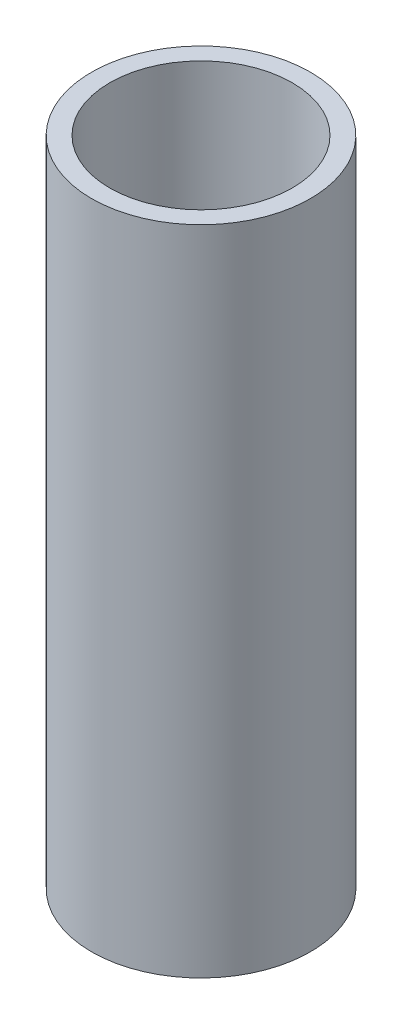
ISO-10303-21;
HEADER;
FILE_DESCRIPTION(('STEP AP214'),'2;1');
FILE_NAME('part.step','',(''),(''),'','','');
FILE_SCHEMA(('AUTOMOTIVE_DESIGN { 1 0 10303 214 1 1 1 1 }'));
ENDSEC;
DATA;
#1=APPLICATION_CONTEXT('core data for automotive mechanical design processes');
#2=APPLICATION_PROTOCOL_DEFINITION('international standard','automotive_design',2000,#1);
#3=PRODUCT_CONTEXT('',#1,'mechanical');
#4=PRODUCT('Part','Part','',(#3));
#5=PRODUCT_RELATED_PRODUCT_CATEGORY('part','',(#4));
#6=PRODUCT_DEFINITION_FORMATION('','',#4);
#7=PRODUCT_DEFINITION_CONTEXT('part definition',#1,'design');
#8=PRODUCT_DEFINITION('design','',#6,#7);
#9=PRODUCT_DEFINITION_SHAPE('','',#8);
#10=(LENGTH_UNIT() NAMED_UNIT(*) SI_UNIT(.MILLI.,.METRE.));
#11=(NAMED_UNIT(*) PLANE_ANGLE_UNIT() SI_UNIT($,.RADIAN.));
#12=(NAMED_UNIT(*) SI_UNIT($,.STERADIAN.) SOLID_ANGLE_UNIT());
#13=UNCERTAINTY_MEASURE_WITH_UNIT(LENGTH_MEASURE(1.E-05),#10,'distance_accuracy_value','');
#14=(GEOMETRIC_REPRESENTATION_CONTEXT(3) GLOBAL_UNCERTAINTY_ASSIGNED_CONTEXT((#13)) GLOBAL_UNIT_ASSIGNED_CONTEXT((#10,
#11,#12)) REPRESENTATION_CONTEXT('',''));
#15=CARTESIAN_POINT('',(0.,0.,0.));
#16=DIRECTION('',(0.,0.,1.));
#17=DIRECTION('',(1.,0.,0.));
#18=AXIS2_PLACEMENT_3D('',#15,#16,#17);
#19=CARTESIAN_POINT('',(0.,71.5,0.));
#20=DIRECTION('',(0.,1.,0.));
#21=DIRECTION('',(0.,0.,1.));
#22=AXIS2_PLACEMENT_3D('',#19,#20,#21);
#23=PLANE('',#22);
#24=CARTESIAN_POINT('',(0.,71.5,0.));
#25=DIRECTION('',(0.,1.,0.));
#26=DIRECTION('',(0.,0.,1.));
#27=AXIS2_PLACEMENT_3D('',#24,#25,#26);
#28=CIRCLE('',#27,12.);
#29=CARTESIAN_POINT('',(0.,71.5,12.));
#30=VERTEX_POINT('',#29);
#31=EDGE_CURVE('E10',#30,#30,#28,.T.);
#32=ORIENTED_EDGE('',*,*,#31,.T.);
#33=EDGE_LOOP('',(#32));
#34=FACE_BOUND('',#33,.T.);
#35=CARTESIAN_POINT('',(0.,71.5,0.));
#36=DIRECTION('',(0.,1.,0.));
#37=DIRECTION('',(0.,0.,1.));
#38=AXIS2_PLACEMENT_3D('',#35,#36,#37);
#39=CIRCLE('',#38,10.);
#40=CARTESIAN_POINT('',(0.,71.5,10.));
#41=VERTEX_POINT('',#40);
#42=EDGE_CURVE('E42',#41,#41,#39,.T.);
#43=ORIENTED_EDGE('',*,*,#42,.F.);
#44=EDGE_LOOP('',(#43));
#45=FACE_BOUND('',#44,.T.);
#46=ADVANCED_FACE('F31',(#34,#45),#23,.T.);
#47=CARTESIAN_POINT('',(0.,0.,0.));
#48=DIRECTION('',(0.,1.,0.));
#49=DIRECTION('',(0.,0.,1.));
#50=AXIS2_PLACEMENT_3D('',#47,#48,#49);
#51=PLANE('',#50);
#52=CARTESIAN_POINT('',(0.,0.,0.));
#53=DIRECTION('',(0.,1.,0.));
#54=DIRECTION('',(0.,0.,1.));
#55=AXIS2_PLACEMENT_3D('',#52,#53,#54);
#56=CIRCLE('',#55,12.);
#57=CARTESIAN_POINT('',(0.,0.,12.));
#58=VERTEX_POINT('',#57);
#59=EDGE_CURVE('E35',#58,#58,#56,.T.);
#60=ORIENTED_EDGE('',*,*,#59,.F.);
#61=EDGE_LOOP('',(#60));
#62=FACE_BOUND('',#61,.T.);
#63=CARTESIAN_POINT('',(0.,0.,0.));
#64=DIRECTION('',(0.,1.,0.));
#65=DIRECTION('',(0.,0.,1.));
#66=AXIS2_PLACEMENT_3D('',#63,#64,#65);
#67=CIRCLE('',#66,10.);
#68=CARTESIAN_POINT('',(0.,0.,10.));
#69=VERTEX_POINT('',#68);
#70=EDGE_CURVE('E44',#69,#69,#67,.T.);
#71=ORIENTED_EDGE('',*,*,#70,.T.);
#72=EDGE_LOOP('',(#71));
#73=FACE_BOUND('',#72,.T.);
#74=ADVANCED_FACE('F54',(#62,#73),#51,.F.);
#75=CARTESIAN_POINT('',(0.,71.5,0.));
#76=DIRECTION('',(0.,-1.,0.));
#77=DIRECTION('',(0.,0.,-1.));
#78=AXIS2_PLACEMENT_3D('',#75,#76,#77);
#79=CYLINDRICAL_SURFACE('',#78,12.);
#80=ORIENTED_EDGE('',*,*,#31,.F.);
#81=EDGE_LOOP('',(#80));
#82=FACE_BOUND('',#81,.T.);
#83=ORIENTED_EDGE('',*,*,#59,.T.);
#84=EDGE_LOOP('',(#83));
#85=FACE_BOUND('',#84,.T.);
#86=ADVANCED_FACE('F33',(#82,#85),#79,.T.);
#87=CARTESIAN_POINT('',(0.,71.5,0.));
#88=DIRECTION('',(0.,-1.,0.));
#89=DIRECTION('',(0.,0.,-1.));
#90=AXIS2_PLACEMENT_3D('',#87,#88,#89);
#91=CYLINDRICAL_SURFACE('',#90,10.);
#92=ORIENTED_EDGE('',*,*,#42,.T.);
#93=EDGE_LOOP('',(#92));
#94=FACE_BOUND('',#93,.T.);
#95=ORIENTED_EDGE('',*,*,#70,.F.);
#96=EDGE_LOOP('',(#95));
#97=FACE_BOUND('',#96,.T.);
#98=ADVANCED_FACE('F50',(#94,#97),#91,.F.);
#99=CLOSED_SHELL('',(#46,#74,#86,#98));
#100=MANIFOLD_SOLID_BREP('B2',#99);
#101=ADVANCED_BREP_SHAPE_REPRESENTATION('',(#18,#100),#14);
#102=SHAPE_DEFINITION_REPRESENTATION(#9,#101);
ENDSEC;
END-ISO-10303-21;
